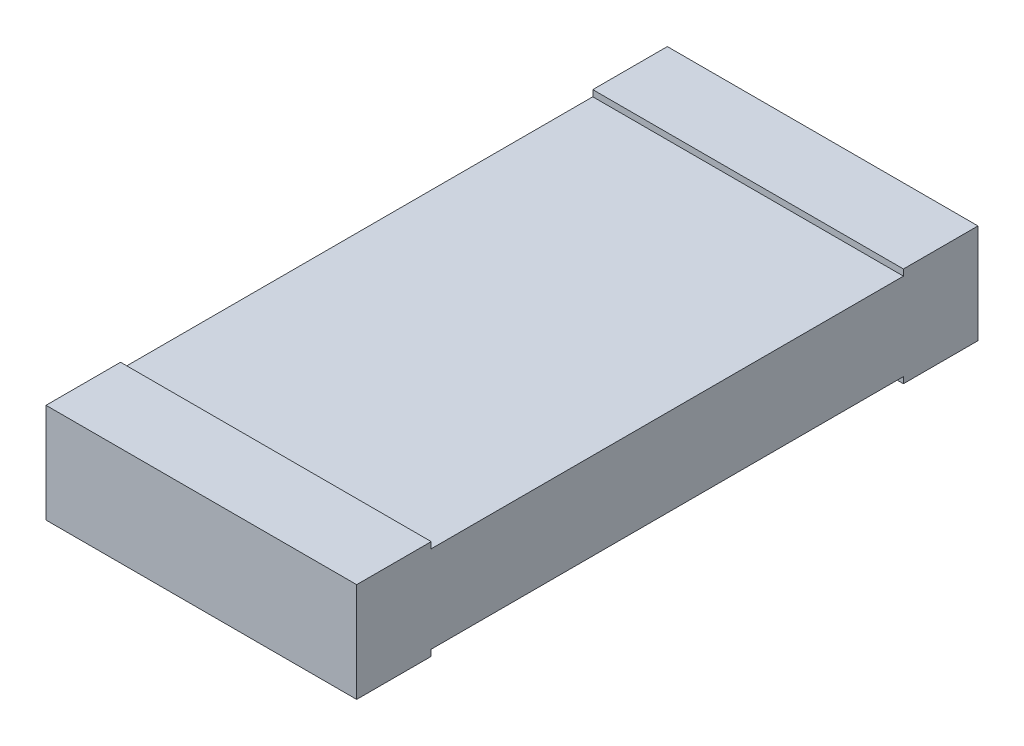
ISO-10303-21;
HEADER;
FILE_DESCRIPTION(('STEP AP214'),'2;1');
FILE_NAME('part.step','',(''),(''),'','','');
FILE_SCHEMA(('AUTOMOTIVE_DESIGN { 1 0 10303 214 1 1 1 1 }'));
ENDSEC;
DATA;
#1=APPLICATION_CONTEXT('core data for automotive mechanical design processes');
#2=APPLICATION_PROTOCOL_DEFINITION('international standard','automotive_design',2000,#1);
#3=PRODUCT_CONTEXT('',#1,'mechanical');
#4=PRODUCT('Part','Part','',(#3));
#5=PRODUCT_RELATED_PRODUCT_CATEGORY('part','',(#4));
#6=PRODUCT_DEFINITION_FORMATION('','',#4);
#7=PRODUCT_DEFINITION_CONTEXT('part definition',#1,'design');
#8=PRODUCT_DEFINITION('design','',#6,#7);
#9=PRODUCT_DEFINITION_SHAPE('','',#8);
#10=(LENGTH_UNIT() NAMED_UNIT(*) SI_UNIT(.MILLI.,.METRE.));
#11=(NAMED_UNIT(*) PLANE_ANGLE_UNIT() SI_UNIT($,.RADIAN.));
#12=(NAMED_UNIT(*) SI_UNIT($,.STERADIAN.) SOLID_ANGLE_UNIT());
#13=UNCERTAINTY_MEASURE_WITH_UNIT(LENGTH_MEASURE(1.E-05),#10,'distance_accuracy_value','');
#14=(GEOMETRIC_REPRESENTATION_CONTEXT(3) GLOBAL_UNCERTAINTY_ASSIGNED_CONTEXT((#13)) GLOBAL_UNIT_ASSIGNED_CONTEXT((#10,
#11,#12)) REPRESENTATION_CONTEXT('',''));
#15=CARTESIAN_POINT('',(0.,0.,0.));
#16=DIRECTION('',(0.,0.,1.));
#17=DIRECTION('',(1.,0.,0.));
#18=AXIS2_PLACEMENT_3D('',#15,#16,#17);
#19=CARTESIAN_POINT('',(-1.25,0.,2.5));
#20=DIRECTION('',(0.,1.,0.));
#21=DIRECTION('',(0.,0.,1.));
#22=AXIS2_PLACEMENT_3D('',#19,#20,#21);
#23=PLANE('',#22);
#24=DIRECTION('',(1.,0.,0.));
#25=VECTOR('',#24,1.);
#26=CARTESIAN_POINT('',(-1.25,0.,-1.9));
#27=LINE('',#26,#25);
#28=CARTESIAN_POINT('',(1.25,0.,-1.9));
#29=VERTEX_POINT('',#28);
#30=CARTESIAN_POINT('',(-1.25,0.,-1.9));
#31=VERTEX_POINT('',#30);
#32=EDGE_CURVE('E148',#29,#31,#27,.F.);
#33=ORIENTED_EDGE('',*,*,#32,.T.);
#34=DIRECTION('',(0.,0.,1.));
#35=VECTOR('',#34,1.);
#36=CARTESIAN_POINT('',(-1.25,0.,2.5));
#37=LINE('',#36,#35);
#38=CARTESIAN_POINT('',(-1.25,0.,-2.5));
#39=VERTEX_POINT('',#38);
#40=EDGE_CURVE('E19',#39,#31,#37,.T.);
#41=ORIENTED_EDGE('',*,*,#40,.F.);
#42=DIRECTION('',(1.,0.,0.));
#43=VECTOR('',#42,1.);
#44=CARTESIAN_POINT('',(-1.25,0.,-2.5));
#45=LINE('',#44,#43);
#46=CARTESIAN_POINT('',(1.25,0.,-2.5));
#47=VERTEX_POINT('',#46);
#48=EDGE_CURVE('E154',#39,#47,#45,.T.);
#49=ORIENTED_EDGE('',*,*,#48,.T.);
#50=DIRECTION('',(0.,0.,1.));
#51=VECTOR('',#50,1.);
#52=CARTESIAN_POINT('',(1.25,0.,2.5));
#53=LINE('',#52,#51);
#54=EDGE_CURVE('E133',#29,#47,#53,.F.);
#55=ORIENTED_EDGE('',*,*,#54,.F.);
#56=EDGE_LOOP('',(#33,#41,#49,#55));
#57=FACE_BOUND('',#56,.T.);
#58=ADVANCED_FACE('F16',(#57),#23,.F.);
#59=CARTESIAN_POINT('',(-1.25,0.,2.5));
#60=DIRECTION('',(0.,1.,0.));
#61=DIRECTION('',(0.,0.,1.));
#62=AXIS2_PLACEMENT_3D('',#59,#60,#61);
#63=PLANE('',#62);
#64=DIRECTION('',(1.,0.,0.));
#65=VECTOR('',#64,1.);
#66=CARTESIAN_POINT('',(-1.25,0.,1.9));
#67=LINE('',#66,#65);
#68=CARTESIAN_POINT('',(-1.25,0.,1.9));
#69=VERTEX_POINT('',#68);
#70=CARTESIAN_POINT('',(1.25,0.,1.9));
#71=VERTEX_POINT('',#70);
#72=EDGE_CURVE('E159',#69,#71,#67,.T.);
#73=ORIENTED_EDGE('',*,*,#72,.T.);
#74=DIRECTION('',(0.,0.,1.));
#75=VECTOR('',#74,1.);
#76=CARTESIAN_POINT('',(1.25,0.,2.5));
#77=LINE('',#76,#75);
#78=CARTESIAN_POINT('',(1.25,0.,2.5));
#79=VERTEX_POINT('',#78);
#80=EDGE_CURVE('E101',#79,#71,#77,.F.);
#81=ORIENTED_EDGE('',*,*,#80,.F.);
#82=DIRECTION('',(-1.,0.,0.));
#83=VECTOR('',#82,1.);
#84=CARTESIAN_POINT('',(-1.25,0.,2.5));
#85=LINE('',#84,#83);
#86=CARTESIAN_POINT('',(-1.25,0.,2.5));
#87=VERTEX_POINT('',#86);
#88=EDGE_CURVE('E110',#79,#87,#85,.T.);
#89=ORIENTED_EDGE('',*,*,#88,.T.);
#90=DIRECTION('',(0.,0.,1.));
#91=VECTOR('',#90,1.);
#92=CARTESIAN_POINT('',(-1.25,0.,2.5));
#93=LINE('',#92,#91);
#94=EDGE_CURVE('E116',#69,#87,#93,.T.);
#95=ORIENTED_EDGE('',*,*,#94,.F.);
#96=EDGE_LOOP('',(#73,#81,#89,#95));
#97=FACE_BOUND('',#96,.T.);
#98=ADVANCED_FACE('F124',(#97),#63,.F.);
#99=CARTESIAN_POINT('',(-1.25,0.8,2.5));
#100=DIRECTION('',(0.,0.,-1.));
#101=DIRECTION('',(-1.,0.,0.));
#102=AXIS2_PLACEMENT_3D('',#99,#100,#101);
#103=PLANE('',#102);
#104=DIRECTION('',(0.,1.,0.));
#105=VECTOR('',#104,1.);
#106=CARTESIAN_POINT('',(1.25,0.8,2.5));
#107=LINE('',#106,#105);
#108=CARTESIAN_POINT('',(1.25,0.8,2.5));
#109=VERTEX_POINT('',#108);
#110=EDGE_CURVE('E115',#109,#79,#107,.F.);
#111=ORIENTED_EDGE('',*,*,#110,.F.);
#112=DIRECTION('',(1.,0.,0.));
#113=VECTOR('',#112,1.);
#114=CARTESIAN_POINT('',(-1.25,0.8,2.5));
#115=LINE('',#114,#113);
#116=CARTESIAN_POINT('',(-1.25,0.8,2.5));
#117=VERTEX_POINT('',#116);
#118=EDGE_CURVE('E113',#117,#109,#115,.T.);
#119=ORIENTED_EDGE('',*,*,#118,.F.);
#120=DIRECTION('',(0.,1.,0.));
#121=VECTOR('',#120,1.);
#122=CARTESIAN_POINT('',(-1.25,0.8,2.5));
#123=LINE('',#122,#121);
#124=EDGE_CURVE('E107',#87,#117,#123,.T.);
#125=ORIENTED_EDGE('',*,*,#124,.F.);
#126=ORIENTED_EDGE('',*,*,#88,.F.);
#127=EDGE_LOOP('',(#111,#119,#125,#126));
#128=FACE_BOUND('',#127,.T.);
#129=ADVANCED_FACE('F109',(#128),#103,.F.);
#130=CARTESIAN_POINT('',(-1.25,0.8,-2.5));
#131=DIRECTION('',(0.,0.,1.));
#132=DIRECTION('',(1.,0.,0.));
#133=AXIS2_PLACEMENT_3D('',#130,#131,#132);
#134=PLANE('',#133);
#135=DIRECTION('',(0.,1.,0.));
#136=VECTOR('',#135,1.);
#137=CARTESIAN_POINT('',(-1.25,0.8,-2.5));
#138=LINE('',#137,#136);
#139=CARTESIAN_POINT('',(-1.25,0.8,-2.5));
#140=VERTEX_POINT('',#139);
#141=EDGE_CURVE('E128',#140,#39,#138,.F.);
#142=ORIENTED_EDGE('',*,*,#141,.F.);
#143=DIRECTION('',(1.,0.,0.));
#144=VECTOR('',#143,1.);
#145=CARTESIAN_POINT('',(-1.25,0.8,-2.5));
#146=LINE('',#145,#144);
#147=CARTESIAN_POINT('',(1.25,0.8,-2.5));
#148=VERTEX_POINT('',#147);
#149=EDGE_CURVE('E171',#148,#140,#146,.F.);
#150=ORIENTED_EDGE('',*,*,#149,.F.);
#151=DIRECTION('',(0.,1.,0.));
#152=VECTOR('',#151,1.);
#153=CARTESIAN_POINT('',(1.25,0.8,-2.5));
#154=LINE('',#153,#152);
#155=EDGE_CURVE('E125',#47,#148,#154,.T.);
#156=ORIENTED_EDGE('',*,*,#155,.F.);
#157=ORIENTED_EDGE('',*,*,#48,.F.);
#158=EDGE_LOOP('',(#142,#150,#156,#157));
#159=FACE_BOUND('',#158,.T.);
#160=ADVANCED_FACE('F255',(#159),#134,.F.);
#161=CARTESIAN_POINT('',(-1.25,-0.319521140078355,-1.9));
#162=DIRECTION('',(0.,0.,-1.));
#163=DIRECTION('',(0.,1.,0.));
#164=AXIS2_PLACEMENT_3D('',#161,#162,#163);
#165=PLANE('',#164);
#166=DIRECTION('',(1.,0.,0.));
#167=VECTOR('',#166,1.);
#168=CARTESIAN_POINT('',(-1.25,0.0500000000000005,-1.9));
#169=LINE('',#168,#167);
#170=CARTESIAN_POINT('',(1.25,0.0500000000000005,-1.9));
#171=VERTEX_POINT('',#170);
#172=CARTESIAN_POINT('',(-1.25,0.0500000000000004,-1.9));
#173=VERTEX_POINT('',#172);
#174=EDGE_CURVE('E150',#171,#173,#169,.F.);
#175=ORIENTED_EDGE('',*,*,#174,.T.);
#176=DIRECTION('',(0.,1.,0.));
#177=VECTOR('',#176,1.);
#178=CARTESIAN_POINT('',(-1.25,-0.319521140078355,-1.9));
#179=LINE('',#178,#177);
#180=EDGE_CURVE('E139',#31,#173,#179,.T.);
#181=ORIENTED_EDGE('',*,*,#180,.F.);
#182=ORIENTED_EDGE('',*,*,#32,.F.);
#183=DIRECTION('',(0.,1.,0.));
#184=VECTOR('',#183,1.);
#185=CARTESIAN_POINT('',(1.25,-0.319521140078355,-1.9));
#186=LINE('',#185,#184);
#187=EDGE_CURVE('E152',#171,#29,#186,.F.);
#188=ORIENTED_EDGE('',*,*,#187,.F.);
#189=EDGE_LOOP('',(#175,#181,#182,#188));
#190=FACE_BOUND('',#189,.T.);
#191=ADVANCED_FACE('F147',(#190),#165,.F.);
#192=CARTESIAN_POINT('',(-1.25,-0.319521140078356,1.9));
#193=DIRECTION('',(0.,0.,1.));
#194=DIRECTION('',(1.,0.,0.));
#195=AXIS2_PLACEMENT_3D('',#192,#193,#194);
#196=PLANE('',#195);
#197=DIRECTION('',(1.,0.,0.));
#198=VECTOR('',#197,1.);
#199=CARTESIAN_POINT('',(-1.25,0.05,1.9));
#200=LINE('',#199,#198);
#201=CARTESIAN_POINT('',(-1.25,0.05,1.9));
#202=VERTEX_POINT('',#201);
#203=CARTESIAN_POINT('',(1.25,0.0500000000000001,1.9));
#204=VERTEX_POINT('',#203);
#205=EDGE_CURVE('E175',#202,#204,#200,.T.);
#206=ORIENTED_EDGE('',*,*,#205,.T.);
#207=DIRECTION('',(0.,1.,0.));
#208=VECTOR('',#207,1.);
#209=CARTESIAN_POINT('',(1.25,-0.319521140078356,1.9));
#210=LINE('',#209,#208);
#211=EDGE_CURVE('E161',#71,#204,#210,.T.);
#212=ORIENTED_EDGE('',*,*,#211,.F.);
#213=ORIENTED_EDGE('',*,*,#72,.F.);
#214=DIRECTION('',(0.,1.,0.));
#215=VECTOR('',#214,1.);
#216=CARTESIAN_POINT('',(-1.25,-0.319521140078356,1.9));
#217=LINE('',#216,#215);
#218=EDGE_CURVE('E121',#202,#69,#217,.F.);
#219=ORIENTED_EDGE('',*,*,#218,.F.);
#220=EDGE_LOOP('',(#206,#212,#213,#219));
#221=FACE_BOUND('',#220,.T.);
#222=ADVANCED_FACE('F248',(#221),#196,.F.);
#223=CARTESIAN_POINT('',(-1.25,0.8,2.5));
#224=DIRECTION('',(0.,1.,0.));
#225=DIRECTION('',(0.,0.,1.));
#226=AXIS2_PLACEMENT_3D('',#223,#224,#225);
#227=PLANE('',#226);
#228=ORIENTED_EDGE('',*,*,#118,.T.);
#229=DIRECTION('',(0.,0.,1.));
#230=VECTOR('',#229,1.);
#231=CARTESIAN_POINT('',(1.25,0.8,2.5));
#232=LINE('',#231,#230);
#233=CARTESIAN_POINT('',(1.25,0.8,1.9));
#234=VERTEX_POINT('',#233);
#235=EDGE_CURVE('E167',#109,#234,#232,.F.);
#236=ORIENTED_EDGE('',*,*,#235,.T.);
#237=DIRECTION('',(1.,0.,0.));
#238=VECTOR('',#237,1.);
#239=CARTESIAN_POINT('',(-1.25,0.8,1.9));
#240=LINE('',#239,#238);
#241=CARTESIAN_POINT('',(-1.25,0.8,1.9));
#242=VERTEX_POINT('',#241);
#243=EDGE_CURVE('E178',#234,#242,#240,.F.);
#244=ORIENTED_EDGE('',*,*,#243,.T.);
#245=DIRECTION('',(0.,0.,1.));
#246=VECTOR('',#245,1.);
#247=CARTESIAN_POINT('',(-1.25,0.8,2.5));
#248=LINE('',#247,#246);
#249=EDGE_CURVE('E164',#242,#117,#248,.T.);
#250=ORIENTED_EDGE('',*,*,#249,.T.);
#251=EDGE_LOOP('',(#228,#236,#244,#250));
#252=FACE_BOUND('',#251,.T.);
#253=ADVANCED_FACE('F244',(#252),#227,.T.);
#254=CARTESIAN_POINT('',(-1.25,0.8,2.5));
#255=DIRECTION('',(0.,1.,0.));
#256=DIRECTION('',(0.,0.,1.));
#257=AXIS2_PLACEMENT_3D('',#254,#255,#256);
#258=PLANE('',#257);
#259=ORIENTED_EDGE('',*,*,#149,.T.);
#260=DIRECTION('',(0.,0.,-1.));
#261=VECTOR('',#260,1.);
#262=CARTESIAN_POINT('',(-1.25,0.8,-2.5));
#263=LINE('',#262,#261);
#264=CARTESIAN_POINT('',(-1.25,0.8,-1.9));
#265=VERTEX_POINT('',#264);
#266=EDGE_CURVE('E181',#140,#265,#263,.F.);
#267=ORIENTED_EDGE('',*,*,#266,.T.);
#268=DIRECTION('',(-1.,0.,0.));
#269=VECTOR('',#268,1.);
#270=CARTESIAN_POINT('',(-1.25,0.8,-1.9));
#271=LINE('',#270,#269);
#272=CARTESIAN_POINT('',(1.25,0.8,-1.9));
#273=VERTEX_POINT('',#272);
#274=EDGE_CURVE('E191',#265,#273,#271,.F.);
#275=ORIENTED_EDGE('',*,*,#274,.T.);
#276=DIRECTION('',(0.,0.,1.));
#277=VECTOR('',#276,1.);
#278=CARTESIAN_POINT('',(1.25,0.8,2.5));
#279=LINE('',#278,#277);
#280=EDGE_CURVE('E169',#273,#148,#279,.F.);
#281=ORIENTED_EDGE('',*,*,#280,.T.);
#282=EDGE_LOOP('',(#259,#267,#275,#281));
#283=FACE_BOUND('',#282,.T.);
#284=ADVANCED_FACE('F240',(#283),#258,.T.);
#285=CARTESIAN_POINT('',(-1.25,0.05,1.9));
#286=DIRECTION('',(0.,1.,0.));
#287=DIRECTION('',(0.,0.,1.));
#288=AXIS2_PLACEMENT_3D('',#285,#286,#287);
#289=PLANE('',#288);
#290=ORIENTED_EDGE('',*,*,#205,.F.);
#291=DIRECTION('',(0.,0.,-1.));
#292=VECTOR('',#291,1.);
#293=CARTESIAN_POINT('',(-1.25,0.05,-2.5));
#294=LINE('',#293,#292);
#295=EDGE_CURVE('E186',#202,#173,#294,.T.);
#296=ORIENTED_EDGE('',*,*,#295,.T.);
#297=ORIENTED_EDGE('',*,*,#174,.F.);
#298=DIRECTION('',(0.,0.,1.));
#299=VECTOR('',#298,1.);
#300=CARTESIAN_POINT('',(1.25,0.0500000000000005,-2.5));
#301=LINE('',#300,#299);
#302=EDGE_CURVE('E198',#171,#204,#301,.T.);
#303=ORIENTED_EDGE('',*,*,#302,.T.);
#304=EDGE_LOOP('',(#290,#296,#297,#303));
#305=FACE_BOUND('',#304,.T.);
#306=ADVANCED_FACE('F237',(#305),#289,.F.);
#307=CARTESIAN_POINT('',(-1.25,1.11952114007836,1.9));
#308=DIRECTION('',(0.,0.,1.));
#309=DIRECTION('',(1.,0.,0.));
#310=AXIS2_PLACEMENT_3D('',#307,#308,#309);
#311=PLANE('',#310);
#312=DIRECTION('',(0.,1.,0.));
#313=VECTOR('',#312,1.);
#314=CARTESIAN_POINT('',(1.25,0.8,1.9));
#315=LINE('',#314,#313);
#316=CARTESIAN_POINT('',(1.25,0.75,1.9));
#317=VERTEX_POINT('',#316);
#318=EDGE_CURVE('E194',#234,#317,#315,.F.);
#319=ORIENTED_EDGE('',*,*,#318,.T.);
#320=DIRECTION('',(1.,0.,0.));
#321=VECTOR('',#320,1.);
#322=CARTESIAN_POINT('',(-1.25,0.75,1.9));
#323=LINE('',#322,#321);
#324=CARTESIAN_POINT('',(-1.25,0.75,1.9));
#325=VERTEX_POINT('',#324);
#326=EDGE_CURVE('E201',#317,#325,#323,.F.);
#327=ORIENTED_EDGE('',*,*,#326,.T.);
#328=DIRECTION('',(0.,1.,0.));
#329=VECTOR('',#328,1.);
#330=CARTESIAN_POINT('',(-1.25,0.8,1.9));
#331=LINE('',#330,#329);
#332=EDGE_CURVE('E183',#325,#242,#331,.T.);
#333=ORIENTED_EDGE('',*,*,#332,.T.);
#334=ORIENTED_EDGE('',*,*,#243,.F.);
#335=EDGE_LOOP('',(#319,#327,#333,#334));
#336=FACE_BOUND('',#335,.T.);
#337=ADVANCED_FACE('F217',(#336),#311,.F.);
#338=CARTESIAN_POINT('',(-1.25,0.8,-2.5));
#339=DIRECTION('',(1.,0.,0.));
#340=DIRECTION('',(0.,0.,-1.));
#341=AXIS2_PLACEMENT_3D('',#338,#339,#340);
#342=PLANE('',#341);
#343=ORIENTED_EDGE('',*,*,#218,.T.);
#344=ORIENTED_EDGE('',*,*,#94,.T.);
#345=ORIENTED_EDGE('',*,*,#124,.T.);
#346=ORIENTED_EDGE('',*,*,#249,.F.);
#347=ORIENTED_EDGE('',*,*,#332,.F.);
#348=DIRECTION('',(0.,0.,-1.));
#349=VECTOR('',#348,1.);
#350=CARTESIAN_POINT('',(-1.25,0.75,1.9));
#351=LINE('',#350,#349);
#352=CARTESIAN_POINT('',(-1.25,0.75,-1.9));
#353=VERTEX_POINT('',#352);
#354=EDGE_CURVE('E204',#325,#353,#351,.T.);
#355=ORIENTED_EDGE('',*,*,#354,.T.);
#356=DIRECTION('',(0.,1.,0.));
#357=VECTOR('',#356,1.);
#358=CARTESIAN_POINT('',(-1.25,1.11952114007836,-1.9));
#359=LINE('',#358,#357);
#360=EDGE_CURVE('E188',#353,#265,#359,.T.);
#361=ORIENTED_EDGE('',*,*,#360,.T.);
#362=ORIENTED_EDGE('',*,*,#266,.F.);
#363=ORIENTED_EDGE('',*,*,#141,.T.);
#364=ORIENTED_EDGE('',*,*,#40,.T.);
#365=ORIENTED_EDGE('',*,*,#180,.T.);
#366=ORIENTED_EDGE('',*,*,#295,.F.);
#367=EDGE_LOOP('',(#343,#344,#345,#346,#347,#355,#361,#362,#363,#364,#365,#366));
#368=FACE_BOUND('',#367,.T.);
#369=ADVANCED_FACE('F119',(#368),#342,.F.);
#370=CARTESIAN_POINT('',(-1.25,1.11952114007836,-1.9));
#371=DIRECTION('',(0.,0.,-1.));
#372=DIRECTION('',(-1.,0.,0.));
#373=AXIS2_PLACEMENT_3D('',#370,#371,#372);
#374=PLANE('',#373);
#375=ORIENTED_EDGE('',*,*,#360,.F.);
#376=DIRECTION('',(1.,0.,0.));
#377=VECTOR('',#376,1.);
#378=CARTESIAN_POINT('',(-1.25,0.75,-1.9));
#379=LINE('',#378,#377);
#380=CARTESIAN_POINT('',(1.25,0.75,-1.9));
#381=VERTEX_POINT('',#380);
#382=EDGE_CURVE('E25',#353,#381,#379,.T.);
#383=ORIENTED_EDGE('',*,*,#382,.T.);
#384=DIRECTION('',(0.,1.,0.));
#385=VECTOR('',#384,1.);
#386=CARTESIAN_POINT('',(1.25,0.8,-1.9));
#387=LINE('',#386,#385);
#388=EDGE_CURVE('E33',#381,#273,#387,.T.);
#389=ORIENTED_EDGE('',*,*,#388,.T.);
#390=ORIENTED_EDGE('',*,*,#274,.F.);
#391=EDGE_LOOP('',(#375,#383,#389,#390));
#392=FACE_BOUND('',#391,.T.);
#393=ADVANCED_FACE('F210',(#392),#374,.F.);
#394=CARTESIAN_POINT('',(1.25,0.8,-2.5));
#395=DIRECTION('',(-1.,0.,0.));
#396=DIRECTION('',(0.,0.,1.));
#397=AXIS2_PLACEMENT_3D('',#394,#395,#396);
#398=PLANE('',#397);
#399=ORIENTED_EDGE('',*,*,#211,.T.);
#400=ORIENTED_EDGE('',*,*,#302,.F.);
#401=ORIENTED_EDGE('',*,*,#187,.T.);
#402=ORIENTED_EDGE('',*,*,#54,.T.);
#403=ORIENTED_EDGE('',*,*,#155,.T.);
#404=ORIENTED_EDGE('',*,*,#280,.F.);
#405=ORIENTED_EDGE('',*,*,#388,.F.);
#406=DIRECTION('',(0.,0.,-1.));
#407=VECTOR('',#406,1.);
#408=CARTESIAN_POINT('',(1.25,0.75,1.9));
#409=LINE('',#408,#407);
#410=EDGE_CURVE('E11',#381,#317,#409,.F.);
#411=ORIENTED_EDGE('',*,*,#410,.T.);
#412=ORIENTED_EDGE('',*,*,#318,.F.);
#413=ORIENTED_EDGE('',*,*,#235,.F.);
#414=ORIENTED_EDGE('',*,*,#110,.T.);
#415=ORIENTED_EDGE('',*,*,#80,.T.);
#416=EDGE_LOOP('',(#399,#400,#401,#402,#403,#404,#405,#411,#412,#413,#414,#415));
#417=FACE_BOUND('',#416,.T.);
#418=ADVANCED_FACE('F220',(#417),#398,.F.);
#419=CARTESIAN_POINT('',(-1.25,0.75,1.9));
#420=DIRECTION('',(0.,-1.,0.));
#421=DIRECTION('',(0.,0.,-1.));
#422=AXIS2_PLACEMENT_3D('',#419,#420,#421);
#423=PLANE('',#422);
#424=ORIENTED_EDGE('',*,*,#382,.F.);
#425=ORIENTED_EDGE('',*,*,#354,.F.);
#426=ORIENTED_EDGE('',*,*,#326,.F.);
#427=ORIENTED_EDGE('',*,*,#410,.F.);
#428=EDGE_LOOP('',(#424,#425,#426,#427));
#429=FACE_BOUND('',#428,.T.);
#430=ADVANCED_FACE('F214',(#429),#423,.F.);
#431=CLOSED_SHELL('',(#58,#98,#129,#160,#191,#222,#253,#284,#306,#337,#369,#393,#418,#430));
#432=MANIFOLD_SOLID_BREP('B1',#431);
#433=ADVANCED_BREP_SHAPE_REPRESENTATION('',(#18,#432),#14);
#434=SHAPE_DEFINITION_REPRESENTATION(#9,#433);
ENDSEC;
END-ISO-10303-21;
